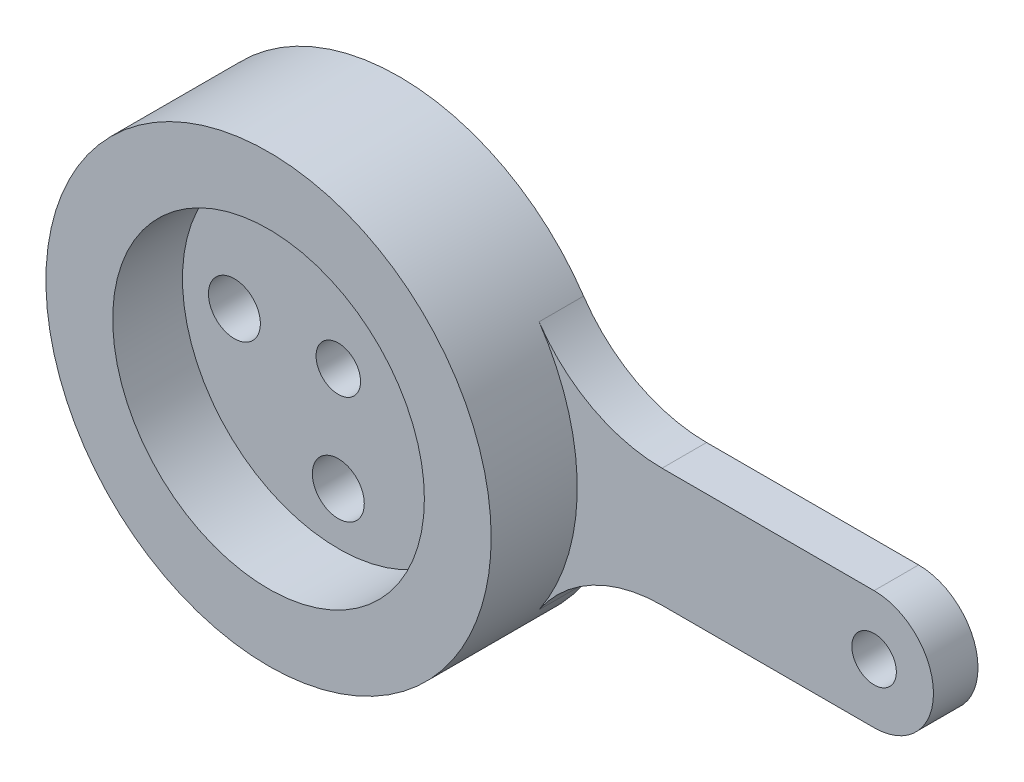
ISO-10303-21;
HEADER;
FILE_DESCRIPTION(('STEP AP214'),'2;1');
FILE_NAME('part.step','',(''),(''),'','','');
FILE_SCHEMA(('AUTOMOTIVE_DESIGN { 1 0 10303 214 1 1 1 1 }'));
ENDSEC;
DATA;
#1=APPLICATION_CONTEXT('core data for automotive mechanical design processes');
#2=APPLICATION_PROTOCOL_DEFINITION('international standard','automotive_design',2000,#1);
#3=PRODUCT_CONTEXT('',#1,'mechanical');
#4=PRODUCT('Part','Part','',(#3));
#5=PRODUCT_RELATED_PRODUCT_CATEGORY('part','',(#4));
#6=PRODUCT_DEFINITION_FORMATION('','',#4);
#7=PRODUCT_DEFINITION_CONTEXT('part definition',#1,'design');
#8=PRODUCT_DEFINITION('design','',#6,#7);
#9=PRODUCT_DEFINITION_SHAPE('','',#8);
#10=(LENGTH_UNIT() NAMED_UNIT(*) SI_UNIT(.MILLI.,.METRE.));
#11=(NAMED_UNIT(*) PLANE_ANGLE_UNIT() SI_UNIT($,.RADIAN.));
#12=(NAMED_UNIT(*) SI_UNIT($,.STERADIAN.) SOLID_ANGLE_UNIT());
#13=UNCERTAINTY_MEASURE_WITH_UNIT(LENGTH_MEASURE(1.E-05),#10,'distance_accuracy_value','');
#14=(GEOMETRIC_REPRESENTATION_CONTEXT(3) GLOBAL_UNCERTAINTY_ASSIGNED_CONTEXT((#13)) GLOBAL_UNIT_ASSIGNED_CONTEXT((#10,
#11,#12)) REPRESENTATION_CONTEXT('',''));
#15=CARTESIAN_POINT('',(0.,0.,0.));
#16=DIRECTION('',(0.,0.,1.));
#17=DIRECTION('',(1.,0.,0.));
#18=AXIS2_PLACEMENT_3D('',#15,#16,#17);
#19=CARTESIAN_POINT('',(0.,0.,8.8));
#20=DIRECTION('',(0.,0.,-1.));
#21=DIRECTION('',(-1.,0.,0.));
#22=AXIS2_PLACEMENT_3D('',#19,#20,#21);
#23=CYLINDRICAL_SURFACE('',#22,15.);
#24=CARTESIAN_POINT('',(0.,0.,8.8));
#25=DIRECTION('',(0.,0.,1.));
#26=DIRECTION('',(1.,0.,0.));
#27=AXIS2_PLACEMENT_3D('',#24,#25,#26);
#28=CIRCLE('',#27,15.);
#29=CARTESIAN_POINT('',(15.,0.,8.8));
#30=VERTEX_POINT('',#29);
#31=EDGE_CURVE('E133',#30,#30,#28,.T.);
#32=ORIENTED_EDGE('',*,*,#31,.F.);
#33=EDGE_LOOP('',(#32));
#34=FACE_BOUND('',#33,.T.);
#35=CARTESIAN_POINT('',(0.,0.,0.));
#36=DIRECTION('',(0.,0.,1.));
#37=DIRECTION('',(1.,0.,0.));
#38=AXIS2_PLACEMENT_3D('',#35,#36,#37);
#39=CIRCLE('',#38,15.);
#40=CARTESIAN_POINT('',(12.4273891063248,8.4,0.));
#41=VERTEX_POINT('',#40);
#42=CARTESIAN_POINT('',(12.4273891063248,-8.4,0.));
#43=VERTEX_POINT('',#42);
#44=EDGE_CURVE('E132',#41,#43,#39,.T.);
#45=ORIENTED_EDGE('',*,*,#44,.T.);
#46=DIRECTION('',(0.,0.,-1.));
#47=VECTOR('',#46,1.);
#48=CARTESIAN_POINT('',(12.4273891063248,-8.4,8.8));
#49=LINE('',#48,#47);
#50=CARTESIAN_POINT('',(12.4273891063248,-8.4,3.));
#51=VERTEX_POINT('',#50);
#52=EDGE_CURVE('E148',#43,#51,#49,.F.);
#53=ORIENTED_EDGE('',*,*,#52,.T.);
#54=CARTESIAN_POINT('',(0.,0.,3.));
#55=DIRECTION('',(0.,0.,1.));
#56=DIRECTION('',(-1.,0.,0.));
#57=AXIS2_PLACEMENT_3D('',#54,#55,#56);
#58=CIRCLE('',#57,15.);
#59=CARTESIAN_POINT('',(12.4273891063248,8.4,3.));
#60=VERTEX_POINT('',#59);
#61=EDGE_CURVE('E55',#51,#60,#58,.T.);
#62=ORIENTED_EDGE('',*,*,#61,.T.);
#63=DIRECTION('',(0.,0.,-1.));
#64=VECTOR('',#63,1.);
#65=CARTESIAN_POINT('',(12.4273891063248,8.4,8.8));
#66=LINE('',#65,#64);
#67=EDGE_CURVE('E136',#60,#41,#66,.T.);
#68=ORIENTED_EDGE('',*,*,#67,.T.);
#69=EDGE_LOOP('',(#45,#53,#62,#68));
#70=FACE_BOUND('',#69,.T.);
#71=ADVANCED_FACE('F39',(#34,#70),#23,.T.);
#72=CARTESIAN_POINT('',(0.,0.,8.8));
#73=DIRECTION('',(0.,0.,1.));
#74=DIRECTION('',(1.,0.,0.));
#75=AXIS2_PLACEMENT_3D('',#72,#73,#74);
#76=PLANE('',#75);
#77=ORIENTED_EDGE('',*,*,#31,.T.);
#78=EDGE_LOOP('',(#77));
#79=FACE_BOUND('',#78,.T.);
#80=CARTESIAN_POINT('',(0.,0.,8.8));
#81=DIRECTION('',(0.,0.,1.));
#82=DIRECTION('',(1.,0.,0.));
#83=AXIS2_PLACEMENT_3D('',#80,#81,#82);
#84=CIRCLE('',#83,10.5);
#85=CARTESIAN_POINT('',(10.5,0.,8.8));
#86=VERTEX_POINT('',#85);
#87=EDGE_CURVE('E187',#86,#86,#84,.T.);
#88=ORIENTED_EDGE('',*,*,#87,.F.);
#89=EDGE_LOOP('',(#88));
#90=FACE_BOUND('',#89,.T.);
#91=ADVANCED_FACE('F207',(#79,#90),#76,.T.);
#92=CARTESIAN_POINT('',(0.,0.,0.));
#93=DIRECTION('',(0.,0.,1.));
#94=DIRECTION('',(1.,0.,0.));
#95=AXIS2_PLACEMENT_3D('',#92,#93,#94);
#96=PLANE('',#95);
#97=CARTESIAN_POINT('',(0.,-7.,0.));
#98=DIRECTION('',(0.,0.,-1.));
#99=DIRECTION('',(-1.,0.,0.));
#100=AXIS2_PLACEMENT_3D('',#97,#98,#99);
#101=CIRCLE('',#100,1.75);
#102=CARTESIAN_POINT('',(-1.75,-7.,0.));
#103=VERTEX_POINT('',#102);
#104=EDGE_CURVE('E159',#103,#103,#101,.T.);
#105=ORIENTED_EDGE('',*,*,#104,.F.);
#106=EDGE_LOOP('',(#105));
#107=FACE_BOUND('',#106,.T.);
#108=CARTESIAN_POINT('',(7.,0.,0.));
#109=DIRECTION('',(0.,0.,-1.));
#110=DIRECTION('',(-1.,0.,0.));
#111=AXIS2_PLACEMENT_3D('',#108,#109,#110);
#112=CIRCLE('',#111,1.75);
#113=CARTESIAN_POINT('',(5.25,0.,0.));
#114=VERTEX_POINT('',#113);
#115=EDGE_CURVE('E431',#114,#114,#112,.T.);
#116=ORIENTED_EDGE('',*,*,#115,.F.);
#117=EDGE_LOOP('',(#116));
#118=FACE_BOUND('',#117,.T.);
#119=CARTESIAN_POINT('',(-7.,0.,0.));
#120=DIRECTION('',(0.,0.,-1.));
#121=DIRECTION('',(1.,0.,0.));
#122=AXIS2_PLACEMENT_3D('',#119,#120,#121);
#123=CIRCLE('',#122,1.75);
#124=CARTESIAN_POINT('',(-5.25,0.,0.));
#125=VERTEX_POINT('',#124);
#126=EDGE_CURVE('E433',#125,#125,#123,.T.);
#127=ORIENTED_EDGE('',*,*,#126,.F.);
#128=EDGE_LOOP('',(#127));
#129=FACE_BOUND('',#128,.T.);
#130=CARTESIAN_POINT('',(0.,7.,0.));
#131=DIRECTION('',(0.,0.,-1.));
#132=DIRECTION('',(1.,0.,0.));
#133=AXIS2_PLACEMENT_3D('',#130,#131,#132);
#134=CIRCLE('',#133,1.75);
#135=CARTESIAN_POINT('',(1.75,7.,0.));
#136=VERTEX_POINT('',#135);
#137=EDGE_CURVE('E193',#136,#136,#134,.T.);
#138=ORIENTED_EDGE('',*,*,#137,.F.);
#139=EDGE_LOOP('',(#138));
#140=FACE_BOUND('',#139,.T.);
#141=CARTESIAN_POINT('',(35.,4.48946435582798E-12,0.));
#142=DIRECTION('',(0.,0.,1.));
#143=DIRECTION('',(1.,0.,0.));
#144=AXIS2_PLACEMENT_3D('',#141,#142,#143);
#145=CIRCLE('',#144,1.5);
#146=CARTESIAN_POINT('',(36.5,4.48946435582798E-12,0.));
#147=VERTEX_POINT('',#146);
#148=EDGE_CURVE('E120',#147,#147,#145,.F.);
#149=ORIENTED_EDGE('',*,*,#148,.F.);
#150=EDGE_LOOP('',(#149));
#151=FACE_BOUND('',#150,.T.);
#152=CARTESIAN_POINT('',(0.,0.,0.));
#153=DIRECTION('',(0.,0.,1.));
#154=DIRECTION('',(1.,0.,0.));
#155=AXIS2_PLACEMENT_3D('',#152,#153,#154);
#156=CIRCLE('',#155,1.5);
#157=CARTESIAN_POINT('',(1.5,0.,0.));
#158=VERTEX_POINT('',#157);
#159=EDGE_CURVE('E128',#158,#158,#156,.T.);
#160=ORIENTED_EDGE('',*,*,#159,.T.);
#161=EDGE_LOOP('',(#160));
#162=FACE_BOUND('',#161,.T.);
#163=ORIENTED_EDGE('',*,*,#44,.F.);
#164=CARTESIAN_POINT('',(20.712315177208,14.,0.));
#165=DIRECTION('',(0.,0.,1.));
#166=DIRECTION('',(1.,0.,0.));
#167=AXIS2_PLACEMENT_3D('',#164,#165,#166);
#168=CIRCLE('',#167,10.);
#169=CARTESIAN_POINT('',(20.712315177208,4.,0.));
#170=VERTEX_POINT('',#169);
#171=EDGE_CURVE('E142',#41,#170,#168,.T.);
#172=ORIENTED_EDGE('',*,*,#171,.T.);
#173=DIRECTION('',(1.,0.,0.));
#174=VECTOR('',#173,1.);
#175=CARTESIAN_POINT('',(35.,4.,0.));
#176=LINE('',#175,#174);
#177=CARTESIAN_POINT('',(35.,4.,0.));
#178=VERTEX_POINT('',#177);
#179=EDGE_CURVE('E116',#170,#178,#176,.T.);
#180=ORIENTED_EDGE('',*,*,#179,.T.);
#181=CARTESIAN_POINT('',(35.,0.,0.));
#182=DIRECTION('',(0.,0.,-1.));
#183=DIRECTION('',(-1.,0.,0.));
#184=AXIS2_PLACEMENT_3D('',#181,#182,#183);
#185=CIRCLE('',#184,4.);
#186=CARTESIAN_POINT('',(35.,-4.,0.));
#187=VERTEX_POINT('',#186);
#188=EDGE_CURVE('E125',#178,#187,#185,.T.);
#189=ORIENTED_EDGE('',*,*,#188,.T.);
#190=DIRECTION('',(-1.,0.,0.));
#191=VECTOR('',#190,1.);
#192=CARTESIAN_POINT('',(35.,-4.,0.));
#193=LINE('',#192,#191);
#194=CARTESIAN_POINT('',(20.712315177208,-4.,0.));
#195=VERTEX_POINT('',#194);
#196=EDGE_CURVE('E99',#187,#195,#193,.T.);
#197=ORIENTED_EDGE('',*,*,#196,.T.);
#198=CARTESIAN_POINT('',(20.712315177208,-14.,0.));
#199=DIRECTION('',(0.,0.,1.));
#200=DIRECTION('',(1.,0.,0.));
#201=AXIS2_PLACEMENT_3D('',#198,#199,#200);
#202=CIRCLE('',#201,10.);
#203=EDGE_CURVE('E48',#195,#43,#202,.T.);
#204=ORIENTED_EDGE('',*,*,#203,.T.);
#205=EDGE_LOOP('',(#163,#172,#180,#189,#197,#204));
#206=FACE_BOUND('',#205,.T.);
#207=ADVANCED_FACE('F203',(#107,#118,#129,#140,#151,#162,#206),#96,.F.);
#208=CARTESIAN_POINT('',(0.,0.,-1.2));
#209=DIRECTION('',(0.,0.,1.));
#210=DIRECTION('',(1.,0.,0.));
#211=AXIS2_PLACEMENT_3D('',#208,#209,#210);
#212=CYLINDRICAL_SURFACE('',#211,1.5);
#213=ORIENTED_EDGE('',*,*,#159,.F.);
#214=EDGE_LOOP('',(#213));
#215=FACE_BOUND('',#214,.T.);
#216=CARTESIAN_POINT('',(0.,0.,4.1));
#217=DIRECTION('',(0.,0.,1.));
#218=DIRECTION('',(1.,0.,0.));
#219=AXIS2_PLACEMENT_3D('',#216,#217,#218);
#220=CIRCLE('',#219,1.5);
#221=CARTESIAN_POINT('',(1.5,0.,4.1));
#222=VERTEX_POINT('',#221);
#223=EDGE_CURVE('E151',#222,#222,#220,.T.);
#224=ORIENTED_EDGE('',*,*,#223,.T.);
#225=EDGE_LOOP('',(#224));
#226=FACE_BOUND('',#225,.T.);
#227=ADVANCED_FACE('F206',(#215,#226),#212,.F.);
#228=CARTESIAN_POINT('',(35.,0.,3.));
#229=DIRECTION('',(0.,0.,-1.));
#230=DIRECTION('',(-1.,0.,0.));
#231=AXIS2_PLACEMENT_3D('',#228,#229,#230);
#232=CYLINDRICAL_SURFACE('',#231,4.);
#233=ORIENTED_EDGE('',*,*,#188,.F.);
#234=DIRECTION('',(0.,0.,-1.));
#235=VECTOR('',#234,1.);
#236=CARTESIAN_POINT('',(35.,4.,3.));
#237=LINE('',#236,#235);
#238=CARTESIAN_POINT('',(35.,4.,3.));
#239=VERTEX_POINT('',#238);
#240=EDGE_CURVE('E104',#239,#178,#237,.T.);
#241=ORIENTED_EDGE('',*,*,#240,.F.);
#242=CARTESIAN_POINT('',(35.,0.,3.));
#243=DIRECTION('',(0.,0.,-1.));
#244=DIRECTION('',(-1.,0.,0.));
#245=AXIS2_PLACEMENT_3D('',#242,#243,#244);
#246=CIRCLE('',#245,4.);
#247=CARTESIAN_POINT('',(35.,-4.,3.));
#248=VERTEX_POINT('',#247);
#249=EDGE_CURVE('E110',#239,#248,#246,.T.);
#250=ORIENTED_EDGE('',*,*,#249,.T.);
#251=DIRECTION('',(0.,0.,-1.));
#252=VECTOR('',#251,1.);
#253=CARTESIAN_POINT('',(35.,-4.,3.));
#254=LINE('',#253,#252);
#255=EDGE_CURVE('E93',#248,#187,#254,.T.);
#256=ORIENTED_EDGE('',*,*,#255,.T.);
#257=EDGE_LOOP('',(#233,#241,#250,#256));
#258=FACE_BOUND('',#257,.T.);
#259=ADVANCED_FACE('F114',(#258),#232,.T.);
#260=CARTESIAN_POINT('',(35.,4.,3.));
#261=DIRECTION('',(0.,1.,0.));
#262=DIRECTION('',(0.,0.,1.));
#263=AXIS2_PLACEMENT_3D('',#260,#261,#262);
#264=PLANE('',#263);
#265=ORIENTED_EDGE('',*,*,#179,.F.);
#266=DIRECTION('',(0.,0.,-1.));
#267=VECTOR('',#266,1.);
#268=CARTESIAN_POINT('',(20.712315177208,4.,3.));
#269=LINE('',#268,#267);
#270=CARTESIAN_POINT('',(20.712315177208,4.,3.));
#271=VERTEX_POINT('',#270);
#272=EDGE_CURVE('E140',#170,#271,#269,.F.);
#273=ORIENTED_EDGE('',*,*,#272,.T.);
#274=DIRECTION('',(1.,0.,0.));
#275=VECTOR('',#274,1.);
#276=CARTESIAN_POINT('',(35.,4.,3.));
#277=LINE('',#276,#275);
#278=EDGE_CURVE('E105',#271,#239,#277,.T.);
#279=ORIENTED_EDGE('',*,*,#278,.T.);
#280=ORIENTED_EDGE('',*,*,#240,.T.);
#281=EDGE_LOOP('',(#265,#273,#279,#280));
#282=FACE_BOUND('',#281,.T.);
#283=ADVANCED_FACE('F218',(#282),#264,.T.);
#284=CARTESIAN_POINT('',(35.,-4.,3.));
#285=DIRECTION('',(0.,-1.,0.));
#286=DIRECTION('',(0.,0.,-1.));
#287=AXIS2_PLACEMENT_3D('',#284,#285,#286);
#288=PLANE('',#287);
#289=DIRECTION('',(-1.,0.,0.));
#290=VECTOR('',#289,1.);
#291=CARTESIAN_POINT('',(35.,-4.,3.));
#292=LINE('',#291,#290);
#293=CARTESIAN_POINT('',(20.712315177208,-4.,3.));
#294=VERTEX_POINT('',#293);
#295=EDGE_CURVE('E97',#248,#294,#292,.T.);
#296=ORIENTED_EDGE('',*,*,#295,.T.);
#297=DIRECTION('',(0.,0.,-1.));
#298=VECTOR('',#297,1.);
#299=CARTESIAN_POINT('',(20.712315177208,-4.,3.));
#300=LINE('',#299,#298);
#301=EDGE_CURVE('E146',#294,#195,#300,.T.);
#302=ORIENTED_EDGE('',*,*,#301,.T.);
#303=ORIENTED_EDGE('',*,*,#196,.F.);
#304=ORIENTED_EDGE('',*,*,#255,.F.);
#305=EDGE_LOOP('',(#296,#302,#303,#304));
#306=FACE_BOUND('',#305,.T.);
#307=ADVANCED_FACE('F95',(#306),#288,.T.);
#308=CARTESIAN_POINT('',(35.,0.,3.));
#309=DIRECTION('',(0.,0.,-1.));
#310=DIRECTION('',(-1.,0.,0.));
#311=AXIS2_PLACEMENT_3D('',#308,#309,#310);
#312=PLANE('',#311);
#313=CARTESIAN_POINT('',(35.,4.48946435582798E-12,3.));
#314=DIRECTION('',(0.,0.,1.));
#315=DIRECTION('',(1.,0.,0.));
#316=AXIS2_PLACEMENT_3D('',#313,#314,#315);
#317=CIRCLE('',#316,1.5);
#318=CARTESIAN_POINT('',(36.5,4.48946435582798E-12,3.));
#319=VERTEX_POINT('',#318);
#320=EDGE_CURVE('E190',#319,#319,#317,.T.);
#321=ORIENTED_EDGE('',*,*,#320,.F.);
#322=EDGE_LOOP('',(#321));
#323=FACE_BOUND('',#322,.T.);
#324=ORIENTED_EDGE('',*,*,#249,.F.);
#325=ORIENTED_EDGE('',*,*,#278,.F.);
#326=CARTESIAN_POINT('',(20.712315177208,14.,3.));
#327=DIRECTION('',(0.,0.,-1.));
#328=DIRECTION('',(-1.,0.,0.));
#329=AXIS2_PLACEMENT_3D('',#326,#327,#328);
#330=CIRCLE('',#329,10.);
#331=EDGE_CURVE('E144',#271,#60,#330,.T.);
#332=ORIENTED_EDGE('',*,*,#331,.T.);
#333=ORIENTED_EDGE('',*,*,#61,.F.);
#334=CARTESIAN_POINT('',(20.712315177208,-14.,3.));
#335=DIRECTION('',(0.,0.,-1.));
#336=DIRECTION('',(-1.,0.,0.));
#337=AXIS2_PLACEMENT_3D('',#334,#335,#336);
#338=CIRCLE('',#337,10.);
#339=EDGE_CURVE('E11',#51,#294,#338,.T.);
#340=ORIENTED_EDGE('',*,*,#339,.T.);
#341=ORIENTED_EDGE('',*,*,#295,.F.);
#342=EDGE_LOOP('',(#324,#325,#332,#333,#340,#341));
#343=FACE_BOUND('',#342,.T.);
#344=ADVANCED_FACE('F108',(#323,#343),#312,.F.);
#345=CARTESIAN_POINT('',(20.712315177208,14.,8.8));
#346=DIRECTION('',(0.,0.,-1.));
#347=DIRECTION('',(-1.,0.,0.));
#348=AXIS2_PLACEMENT_3D('',#345,#346,#347);
#349=CYLINDRICAL_SURFACE('',#348,10.);
#350=ORIENTED_EDGE('',*,*,#331,.F.);
#351=ORIENTED_EDGE('',*,*,#272,.F.);
#352=ORIENTED_EDGE('',*,*,#171,.F.);
#353=ORIENTED_EDGE('',*,*,#67,.F.);
#354=EDGE_LOOP('',(#350,#351,#352,#353));
#355=FACE_BOUND('',#354,.T.);
#356=ADVANCED_FACE('F221',(#355),#349,.F.);
#357=CARTESIAN_POINT('',(20.712315177208,-14.,8.8));
#358=DIRECTION('',(0.,0.,-1.));
#359=DIRECTION('',(-1.,0.,0.));
#360=AXIS2_PLACEMENT_3D('',#357,#358,#359);
#361=CYLINDRICAL_SURFACE('',#360,10.);
#362=ORIENTED_EDGE('',*,*,#339,.F.);
#363=ORIENTED_EDGE('',*,*,#52,.F.);
#364=ORIENTED_EDGE('',*,*,#203,.F.);
#365=ORIENTED_EDGE('',*,*,#301,.F.);
#366=EDGE_LOOP('',(#362,#363,#364,#365));
#367=FACE_BOUND('',#366,.T.);
#368=ADVANCED_FACE('F41',(#367),#361,.F.);
#369=CARTESIAN_POINT('',(35.,4.48946435582798E-12,-4.24264068711929));
#370=DIRECTION('',(0.,0.,1.));
#371=DIRECTION('',(1.,0.,0.));
#372=AXIS2_PLACEMENT_3D('',#369,#370,#371);
#373=CYLINDRICAL_SURFACE('',#372,1.5);
#374=ORIENTED_EDGE('',*,*,#148,.T.);
#375=EDGE_LOOP('',(#374));
#376=FACE_BOUND('',#375,.T.);
#377=ORIENTED_EDGE('',*,*,#320,.T.);
#378=EDGE_LOOP('',(#377));
#379=FACE_BOUND('',#378,.T.);
#380=ADVANCED_FACE('F201',(#376,#379),#373,.F.);
#381=CARTESIAN_POINT('',(0.,0.,38.498484809835));
#382=DIRECTION('',(0.,0.,-1.));
#383=DIRECTION('',(-1.,0.,0.));
#384=AXIS2_PLACEMENT_3D('',#381,#382,#383);
#385=CYLINDRICAL_SURFACE('',#384,10.5);
#386=CARTESIAN_POINT('',(0.,0.,4.1));
#387=DIRECTION('',(0.,0.,1.));
#388=DIRECTION('',(1.,0.,0.));
#389=AXIS2_PLACEMENT_3D('',#386,#387,#388);
#390=CIRCLE('',#389,10.5);
#391=CARTESIAN_POINT('',(10.5,0.,4.1));
#392=VERTEX_POINT('',#391);
#393=EDGE_CURVE('E154',#392,#392,#390,.T.);
#394=ORIENTED_EDGE('',*,*,#393,.F.);
#395=EDGE_LOOP('',(#394));
#396=FACE_BOUND('',#395,.T.);
#397=ORIENTED_EDGE('',*,*,#87,.T.);
#398=EDGE_LOOP('',(#397));
#399=FACE_BOUND('',#398,.T.);
#400=ADVANCED_FACE('F175',(#396,#399),#385,.F.);
#401=CARTESIAN_POINT('',(0.,0.,4.1));
#402=DIRECTION('',(0.,0.,1.));
#403=DIRECTION('',(1.,0.,0.));
#404=AXIS2_PLACEMENT_3D('',#401,#402,#403);
#405=PLANE('',#404);
#406=CARTESIAN_POINT('',(0.,-7.,4.1));
#407=DIRECTION('',(0.,0.,1.));
#408=DIRECTION('',(1.,0.,0.));
#409=AXIS2_PLACEMENT_3D('',#406,#407,#408);
#410=CIRCLE('',#409,1.75);
#411=CARTESIAN_POINT('',(1.75,-7.,4.1));
#412=VERTEX_POINT('',#411);
#413=EDGE_CURVE('E43',#412,#412,#410,.T.);
#414=ORIENTED_EDGE('',*,*,#413,.F.);
#415=EDGE_LOOP('',(#414));
#416=FACE_BOUND('',#415,.T.);
#417=CARTESIAN_POINT('',(7.,0.,4.1));
#418=DIRECTION('',(0.,0.,1.));
#419=DIRECTION('',(1.,0.,0.));
#420=AXIS2_PLACEMENT_3D('',#417,#418,#419);
#421=CIRCLE('',#420,1.75);
#422=CARTESIAN_POINT('',(8.75,0.,4.1));
#423=VERTEX_POINT('',#422);
#424=EDGE_CURVE('E161',#423,#423,#421,.T.);
#425=ORIENTED_EDGE('',*,*,#424,.F.);
#426=EDGE_LOOP('',(#425));
#427=FACE_BOUND('',#426,.T.);
#428=CARTESIAN_POINT('',(-7.,0.,4.1));
#429=DIRECTION('',(0.,0.,1.));
#430=DIRECTION('',(1.,0.,0.));
#431=AXIS2_PLACEMENT_3D('',#428,#429,#430);
#432=CIRCLE('',#431,1.75);
#433=CARTESIAN_POINT('',(-5.25,0.,4.1));
#434=VERTEX_POINT('',#433);
#435=EDGE_CURVE('E158',#434,#434,#432,.T.);
#436=ORIENTED_EDGE('',*,*,#435,.F.);
#437=EDGE_LOOP('',(#436));
#438=FACE_BOUND('',#437,.T.);
#439=CARTESIAN_POINT('',(0.,7.,4.1));
#440=DIRECTION('',(0.,0.,1.));
#441=DIRECTION('',(1.,0.,0.));
#442=AXIS2_PLACEMENT_3D('',#439,#440,#441);
#443=CIRCLE('',#442,1.75);
#444=CARTESIAN_POINT('',(1.75,7.,4.1));
#445=VERTEX_POINT('',#444);
#446=EDGE_CURVE('E155',#445,#445,#443,.T.);
#447=ORIENTED_EDGE('',*,*,#446,.F.);
#448=EDGE_LOOP('',(#447));
#449=FACE_BOUND('',#448,.T.);
#450=ORIENTED_EDGE('',*,*,#223,.F.);
#451=EDGE_LOOP('',(#450));
#452=FACE_BOUND('',#451,.T.);
#453=ORIENTED_EDGE('',*,*,#393,.T.);
#454=EDGE_LOOP('',(#453));
#455=FACE_BOUND('',#454,.T.);
#456=ADVANCED_FACE('F171',(#416,#427,#438,#449,#452,#455),#405,.T.);
#457=CARTESIAN_POINT('',(0.,7.,8.8));
#458=DIRECTION('',(0.,0.,-1.));
#459=DIRECTION('',(-1.,0.,0.));
#460=AXIS2_PLACEMENT_3D('',#457,#458,#459);
#461=CYLINDRICAL_SURFACE('',#460,1.75);
#462=ORIENTED_EDGE('',*,*,#446,.T.);
#463=EDGE_LOOP('',(#462));
#464=FACE_BOUND('',#463,.T.);
#465=ORIENTED_EDGE('',*,*,#137,.T.);
#466=EDGE_LOOP('',(#465));
#467=FACE_BOUND('',#466,.T.);
#468=ADVANCED_FACE('F174',(#464,#467),#461,.F.);
#469=CARTESIAN_POINT('',(-7.,0.,8.8));
#470=DIRECTION('',(0.,0.,-1.));
#471=DIRECTION('',(-1.,0.,0.));
#472=AXIS2_PLACEMENT_3D('',#469,#470,#471);
#473=CYLINDRICAL_SURFACE('',#472,1.75);
#474=ORIENTED_EDGE('',*,*,#435,.T.);
#475=EDGE_LOOP('',(#474));
#476=FACE_BOUND('',#475,.T.);
#477=ORIENTED_EDGE('',*,*,#126,.T.);
#478=EDGE_LOOP('',(#477));
#479=FACE_BOUND('',#478,.T.);
#480=ADVANCED_FACE('F254',(#476,#479),#473,.F.);
#481=CARTESIAN_POINT('',(7.,0.,8.8));
#482=DIRECTION('',(0.,0.,-1.));
#483=DIRECTION('',(-1.,0.,0.));
#484=AXIS2_PLACEMENT_3D('',#481,#482,#483);
#485=CYLINDRICAL_SURFACE('',#484,1.75);
#486=ORIENTED_EDGE('',*,*,#424,.T.);
#487=EDGE_LOOP('',(#486));
#488=FACE_BOUND('',#487,.T.);
#489=ORIENTED_EDGE('',*,*,#115,.T.);
#490=EDGE_LOOP('',(#489));
#491=FACE_BOUND('',#490,.T.);
#492=ADVANCED_FACE('F258',(#488,#491),#485,.F.);
#493=CARTESIAN_POINT('',(0.,-7.,8.8));
#494=DIRECTION('',(0.,0.,-1.));
#495=DIRECTION('',(-1.,0.,0.));
#496=AXIS2_PLACEMENT_3D('',#493,#494,#495);
#497=CYLINDRICAL_SURFACE('',#496,1.75);
#498=ORIENTED_EDGE('',*,*,#413,.T.);
#499=EDGE_LOOP('',(#498));
#500=FACE_BOUND('',#499,.T.);
#501=ORIENTED_EDGE('',*,*,#104,.T.);
#502=EDGE_LOOP('',(#501));
#503=FACE_BOUND('',#502,.T.);
#504=ADVANCED_FACE('F168',(#500,#503),#497,.F.);
#505=CLOSED_SHELL('',(#71,#91,#207,#227,#259,#283,#307,#344,#356,#368,#380,#400,#456,#468,#480,
#492,#504));
#506=MANIFOLD_SOLID_BREP('B2',#505);
#507=ADVANCED_BREP_SHAPE_REPRESENTATION('',(#18,#506),#14);
#508=SHAPE_DEFINITION_REPRESENTATION(#9,#507);
ENDSEC;
END-ISO-10303-21;
